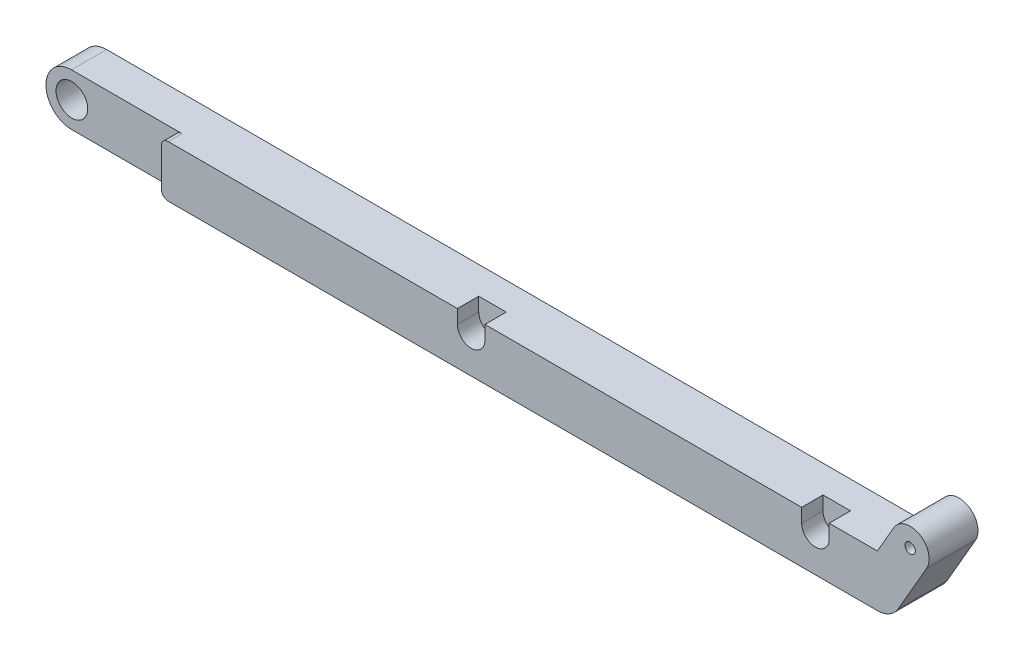
ISO-10303-21;
HEADER;
FILE_DESCRIPTION(('STEP AP214'),'2;1');
FILE_NAME('part.step','',(''),(''),'','','');
FILE_SCHEMA(('AUTOMOTIVE_DESIGN { 1 0 10303 214 1 1 1 1 }'));
ENDSEC;
DATA;
#1=APPLICATION_CONTEXT('core data for automotive mechanical design processes');
#2=APPLICATION_PROTOCOL_DEFINITION('international standard','automotive_design',2000,#1);
#3=PRODUCT_CONTEXT('',#1,'mechanical');
#4=PRODUCT('Part','Part','',(#3));
#5=PRODUCT_RELATED_PRODUCT_CATEGORY('part','',(#4));
#6=PRODUCT_DEFINITION_FORMATION('','',#4);
#7=PRODUCT_DEFINITION_CONTEXT('part definition',#1,'design');
#8=PRODUCT_DEFINITION('design','',#6,#7);
#9=PRODUCT_DEFINITION_SHAPE('','',#8);
#10=(LENGTH_UNIT() NAMED_UNIT(*) SI_UNIT(.MILLI.,.METRE.));
#11=(NAMED_UNIT(*) PLANE_ANGLE_UNIT() SI_UNIT($,.RADIAN.));
#12=(NAMED_UNIT(*) SI_UNIT($,.STERADIAN.) SOLID_ANGLE_UNIT());
#13=UNCERTAINTY_MEASURE_WITH_UNIT(LENGTH_MEASURE(1.E-05),#10,'distance_accuracy_value','');
#14=(GEOMETRIC_REPRESENTATION_CONTEXT(3) GLOBAL_UNCERTAINTY_ASSIGNED_CONTEXT((#13)) GLOBAL_UNIT_ASSIGNED_CONTEXT((#10,
#11,#12)) REPRESENTATION_CONTEXT('',''));
#15=CARTESIAN_POINT('',(0.,0.,0.));
#16=DIRECTION('',(0.,0.,1.));
#17=DIRECTION('',(1.,0.,0.));
#18=AXIS2_PLACEMENT_3D('',#15,#16,#17);
#19=CARTESIAN_POINT('',(101.25,3.50000000000002,10.2));
#20=DIRECTION('',(0.,0.,-1.));
#21=DIRECTION('',(-1.,0.,0.));
#22=AXIS2_PLACEMENT_3D('',#19,#20,#21);
#23=CYLINDRICAL_SURFACE('',#22,4.);
#24=CARTESIAN_POINT('',(101.25,3.50000000000001,8.));
#25=DIRECTION('',(0.,0.,-1.));
#26=DIRECTION('',(-1.,0.,0.));
#27=AXIS2_PLACEMENT_3D('',#24,#25,#26);
#28=CIRCLE('',#27,4.);
#29=CARTESIAN_POINT('',(105.25,3.50000000000002,8.));
#30=VERTEX_POINT('',#29);
#31=CARTESIAN_POINT('',(97.2500000000003,3.50000000000002,8.));
#32=VERTEX_POINT('',#31);
#33=EDGE_CURVE('E251',#30,#32,#28,.T.);
#34=ORIENTED_EDGE('',*,*,#33,.T.);
#35=DIRECTION('',(0.,0.,-1.));
#36=VECTOR('',#35,1.);
#37=CARTESIAN_POINT('',(97.2500000000003,3.50000000000002,10.2));
#38=LINE('',#37,#36);
#39=CARTESIAN_POINT('',(97.2500000000003,3.50000000000002,14.2));
#40=VERTEX_POINT('',#39);
#41=EDGE_CURVE('E345',#40,#32,#38,.T.);
#42=ORIENTED_EDGE('',*,*,#41,.F.);
#43=CARTESIAN_POINT('',(101.25,3.50000000000002,14.2));
#44=DIRECTION('',(0.,0.,-1.));
#45=DIRECTION('',(1.,0.,0.));
#46=AXIS2_PLACEMENT_3D('',#43,#44,#45);
#47=CIRCLE('',#46,4.);
#48=CARTESIAN_POINT('',(105.25,3.50000000000002,14.2));
#49=VERTEX_POINT('',#48);
#50=EDGE_CURVE('E221',#49,#40,#47,.T.);
#51=ORIENTED_EDGE('',*,*,#50,.F.);
#52=DIRECTION('',(0.,0.,-1.));
#53=VECTOR('',#52,1.);
#54=CARTESIAN_POINT('',(105.25,3.50000000000002,10.2));
#55=LINE('',#54,#53);
#56=EDGE_CURVE('E290',#49,#30,#55,.T.);
#57=ORIENTED_EDGE('',*,*,#56,.T.);
#58=EDGE_LOOP('',(#34,#42,#51,#57));
#59=FACE_BOUND('',#58,.T.);
#60=ADVANCED_FACE('F33',(#59),#23,.F.);
#61=CARTESIAN_POINT('',(97.2500000000003,3.50000000000002,10.2));
#62=DIRECTION('',(-1.,0.,0.));
#63=DIRECTION('',(0.,0.,1.));
#64=AXIS2_PLACEMENT_3D('',#61,#62,#63);
#65=PLANE('',#64);
#66=DIRECTION('',(0.,1.,0.));
#67=VECTOR('',#66,1.);
#68=CARTESIAN_POINT('',(97.2500000000003,7.50000000000002,8.));
#69=LINE('',#68,#67);
#70=CARTESIAN_POINT('',(97.2500000000003,7.50000000000002,8.));
#71=VERTEX_POINT('',#70);
#72=EDGE_CURVE('E255',#32,#71,#69,.T.);
#73=ORIENTED_EDGE('',*,*,#72,.T.);
#74=DIRECTION('',(0.,0.,-1.));
#75=VECTOR('',#74,1.);
#76=CARTESIAN_POINT('',(97.2500000000003,7.50000000000002,10.2));
#77=LINE('',#76,#75);
#78=CARTESIAN_POINT('',(97.2500000000003,7.50000000000002,14.2));
#79=VERTEX_POINT('',#78);
#80=EDGE_CURVE('E342',#79,#71,#77,.T.);
#81=ORIENTED_EDGE('',*,*,#80,.F.);
#82=DIRECTION('',(0.,1.,0.));
#83=VECTOR('',#82,1.);
#84=CARTESIAN_POINT('',(97.2500000000003,3.50000000000002,14.2));
#85=LINE('',#84,#83);
#86=EDGE_CURVE('E224',#40,#79,#85,.T.);
#87=ORIENTED_EDGE('',*,*,#86,.F.);
#88=ORIENTED_EDGE('',*,*,#41,.T.);
#89=EDGE_LOOP('',(#73,#81,#87,#88));
#90=FACE_BOUND('',#89,.T.);
#91=ADVANCED_FACE('F421',(#90),#65,.F.);
#92=CARTESIAN_POINT('',(105.25,3.50000000000002,10.2));
#93=DIRECTION('',(1.,0.,0.));
#94=DIRECTION('',(0.,0.,-1.));
#95=AXIS2_PLACEMENT_3D('',#92,#93,#94);
#96=PLANE('',#95);
#97=DIRECTION('',(0.,-1.,0.));
#98=VECTOR('',#97,1.);
#99=CARTESIAN_POINT('',(105.25,3.50000000000002,8.));
#100=LINE('',#99,#98);
#101=CARTESIAN_POINT('',(105.25,7.50000000000002,8.));
#102=VERTEX_POINT('',#101);
#103=EDGE_CURVE('E260',#102,#30,#100,.T.);
#104=ORIENTED_EDGE('',*,*,#103,.T.);
#105=ORIENTED_EDGE('',*,*,#56,.F.);
#106=DIRECTION('',(0.,-1.,0.));
#107=VECTOR('',#106,1.);
#108=CARTESIAN_POINT('',(105.25,7.50000000000002,14.2));
#109=LINE('',#108,#107);
#110=CARTESIAN_POINT('',(105.25,7.50000000000002,14.2));
#111=VERTEX_POINT('',#110);
#112=EDGE_CURVE('E218',#111,#49,#109,.T.);
#113=ORIENTED_EDGE('',*,*,#112,.F.);
#114=DIRECTION('',(0.,0.,-1.));
#115=VECTOR('',#114,1.);
#116=CARTESIAN_POINT('',(105.25,7.50000000000002,10.2));
#117=LINE('',#116,#115);
#118=EDGE_CURVE('E308',#111,#102,#117,.T.);
#119=ORIENTED_EDGE('',*,*,#118,.T.);
#120=EDGE_LOOP('',(#104,#105,#113,#119));
#121=FACE_BOUND('',#120,.T.);
#122=ADVANCED_FACE('F427',(#121),#96,.F.);
#123=CARTESIAN_POINT('',(101.25,3.50000000000002,10.2));
#124=DIRECTION('',(0.,0.,1.));
#125=DIRECTION('',(1.,0.,0.));
#126=AXIS2_PLACEMENT_3D('',#123,#124,#125);
#127=PLANE('',#126);
#128=DIRECTION('',(0.,-1.,0.));
#129=VECTOR('',#128,1.);
#130=CARTESIAN_POINT('',(-88.7499999999997,7.49999999999999,10.2));
#131=LINE('',#130,#129);
#132=CARTESIAN_POINT('',(-88.7499999999997,5.49999999999993,10.2));
#133=VERTEX_POINT('',#132);
#134=CARTESIAN_POINT('',(-88.7499999999997,-5.5,10.2));
#135=VERTEX_POINT('',#134);
#136=EDGE_CURVE('E240',#133,#135,#131,.T.);
#137=ORIENTED_EDGE('',*,*,#136,.F.);
#138=CARTESIAN_POINT('',(-86.7499999999997,5.49999999999993,10.2));
#139=DIRECTION('',(0.,0.,1.));
#140=DIRECTION('',(1.,0.,0.));
#141=AXIS2_PLACEMENT_3D('',#138,#139,#140);
#142=CIRCLE('',#141,2.);
#143=CARTESIAN_POINT('',(-86.7499999999997,7.49999999999993,10.2));
#144=VERTEX_POINT('',#143);
#145=EDGE_CURVE('E11',#133,#144,#142,.F.);
#146=ORIENTED_EDGE('',*,*,#145,.T.);
#147=DIRECTION('',(-1.,0.,0.));
#148=VECTOR('',#147,1.);
#149=CARTESIAN_POINT('',(-118.85,7.5,10.2));
#150=LINE('',#149,#148);
#151=CARTESIAN_POINT('',(-118.85,7.5,10.2));
#152=VERTEX_POINT('',#151);
#153=EDGE_CURVE('E48',#144,#152,#150,.T.);
#154=ORIENTED_EDGE('',*,*,#153,.T.);
#155=CARTESIAN_POINT('',(-118.85,0.0999999999999988,10.2));
#156=DIRECTION('',(0.,0.,1.));
#157=DIRECTION('',(1.,0.,0.));
#158=AXIS2_PLACEMENT_3D('',#155,#156,#157);
#159=CIRCLE('',#158,7.39999999999999);
#160=CARTESIAN_POINT('',(-126.25,0.0999999999999997,10.2));
#161=VERTEX_POINT('',#160);
#162=EDGE_CURVE('E281',#152,#161,#159,.T.);
#163=ORIENTED_EDGE('',*,*,#162,.T.);
#164=DIRECTION('',(0.,-1.,0.));
#165=VECTOR('',#164,1.);
#166=CARTESIAN_POINT('',(-126.25,0.0999999999999988,10.2));
#167=LINE('',#166,#165);
#168=CARTESIAN_POINT('',(-126.25,-0.0999999999999994,10.2));
#169=VERTEX_POINT('',#168);
#170=EDGE_CURVE('E284',#161,#169,#167,.T.);
#171=ORIENTED_EDGE('',*,*,#170,.T.);
#172=CARTESIAN_POINT('',(-118.85,-0.0999999999999985,10.2));
#173=DIRECTION('',(0.,0.,1.));
#174=DIRECTION('',(1.,0.,0.));
#175=AXIS2_PLACEMENT_3D('',#172,#173,#174);
#176=CIRCLE('',#175,7.39999999999999);
#177=CARTESIAN_POINT('',(-118.85,-7.49999999999999,10.2));
#178=VERTEX_POINT('',#177);
#179=EDGE_CURVE('E286',#169,#178,#176,.T.);
#180=ORIENTED_EDGE('',*,*,#179,.T.);
#181=DIRECTION('',(1.,0.,0.));
#182=VECTOR('',#181,1.);
#183=CARTESIAN_POINT('',(-118.85,-7.5,10.2));
#184=LINE('',#183,#182);
#185=CARTESIAN_POINT('',(-86.7499999999997,-7.5,10.2));
#186=VERTEX_POINT('',#185);
#187=EDGE_CURVE('E288',#178,#186,#184,.T.);
#188=ORIENTED_EDGE('',*,*,#187,.T.);
#189=CARTESIAN_POINT('',(-86.7499999999997,-5.5,10.2));
#190=DIRECTION('',(0.,0.,1.));
#191=DIRECTION('',(1.,0.,0.));
#192=AXIS2_PLACEMENT_3D('',#189,#190,#191);
#193=CIRCLE('',#192,2.);
#194=EDGE_CURVE('E41',#186,#135,#193,.F.);
#195=ORIENTED_EDGE('',*,*,#194,.T.);
#196=EDGE_LOOP('',(#137,#146,#154,#163,#171,#180,#188,#195));
#197=FACE_BOUND('',#196,.T.);
#198=CARTESIAN_POINT('',(-118.75,0.,10.2));
#199=DIRECTION('',(0.,0.,1.));
#200=DIRECTION('',(1.,0.,0.));
#201=AXIS2_PLACEMENT_3D('',#198,#199,#200);
#202=CIRCLE('',#201,4.59999999999998);
#203=CARTESIAN_POINT('',(-114.15,0.,10.2));
#204=VERTEX_POINT('',#203);
#205=EDGE_CURVE('E274',#204,#204,#202,.T.);
#206=ORIENTED_EDGE('',*,*,#205,.F.);
#207=EDGE_LOOP('',(#206));
#208=FACE_BOUND('',#207,.T.);
#209=ADVANCED_FACE('F361',(#197,#208),#127,.T.);
#210=CARTESIAN_POINT('',(101.25,3.50000000000002,0.));
#211=DIRECTION('',(0.,0.,1.));
#212=DIRECTION('',(1.,0.,0.));
#213=AXIS2_PLACEMENT_3D('',#210,#211,#212);
#214=PLANE('',#213);
#215=CARTESIAN_POINT('',(128.776279441629,13.,0.));
#216=DIRECTION('',(0.,0.,-1.));
#217=DIRECTION('',(-1.,0.,0.));
#218=AXIS2_PLACEMENT_3D('',#215,#216,#217);
#219=CIRCLE('',#218,3.59999999999999);
#220=CARTESIAN_POINT('',(125.176279441629,13.,0.));
#221=VERTEX_POINT('',#220);
#222=EDGE_CURVE('E247',#221,#221,#219,.T.);
#223=ORIENTED_EDGE('',*,*,#222,.F.);
#224=EDGE_LOOP('',(#223));
#225=FACE_BOUND('',#224,.T.);
#226=CARTESIAN_POINT('',(-118.85,0.0999999999999988,0.));
#227=DIRECTION('',(0.,0.,1.));
#228=DIRECTION('',(1.,0.,0.));
#229=AXIS2_PLACEMENT_3D('',#226,#227,#228);
#230=CIRCLE('',#229,7.39999999999999);
#231=CARTESIAN_POINT('',(-118.85,7.5,0.));
#232=VERTEX_POINT('',#231);
#233=CARTESIAN_POINT('',(-126.25,0.0999999999999997,0.));
#234=VERTEX_POINT('',#233);
#235=EDGE_CURVE('E277',#232,#234,#230,.T.);
#236=ORIENTED_EDGE('',*,*,#235,.F.);
#237=DIRECTION('',(-1.,0.,0.));
#238=VECTOR('',#237,1.);
#239=CARTESIAN_POINT('',(105.25,7.50000000000002,0.));
#240=LINE('',#239,#238);
#241=CARTESIAN_POINT('',(119.25,7.50000000000003,0.));
#242=VERTEX_POINT('',#241);
#243=EDGE_CURVE('E282',#242,#232,#240,.T.);
#244=ORIENTED_EDGE('',*,*,#243,.F.);
#245=DIRECTION('',(-0.499999999999999,-0.866025403784439,0.));
#246=VECTOR('',#245,1.);
#247=CARTESIAN_POINT('',(119.25,7.50000000000003,0.));
#248=LINE('',#247,#246);
#249=CARTESIAN_POINT('',(124.013139720815,15.75,0.));
#250=VERTEX_POINT('',#249);
#251=EDGE_CURVE('E303',#250,#242,#248,.T.);
#252=ORIENTED_EDGE('',*,*,#251,.F.);
#253=CARTESIAN_POINT('',(128.776279441629,13.,0.));
#254=DIRECTION('',(0.,0.,1.));
#255=DIRECTION('',(-1.,0.,0.));
#256=AXIS2_PLACEMENT_3D('',#253,#254,#255);
#257=CIRCLE('',#256,5.49999999999999);
#258=CARTESIAN_POINT('',(133.539419162443,10.2500000000001,0.));
#259=VERTEX_POINT('',#258);
#260=EDGE_CURVE('E301',#259,#250,#257,.T.);
#261=ORIENTED_EDGE('',*,*,#260,.F.);
#262=DIRECTION('',(0.499999999999996,0.866025403784441,0.));
#263=VECTOR('',#262,1.);
#264=CARTESIAN_POINT('',(125.312177826491,-3.99999999999998,0.));
#265=LINE('',#264,#263);
#266=CARTESIAN_POINT('',(125.312177826491,-3.99999999999997,0.));
#267=VERTEX_POINT('',#266);
#268=EDGE_CURVE('E299',#267,#259,#265,.T.);
#269=ORIENTED_EDGE('',*,*,#268,.F.);
#270=CARTESIAN_POINT('',(119.25,-0.499999999999999,0.));
#271=DIRECTION('',(0.,0.,1.));
#272=DIRECTION('',(1.,0.,0.));
#273=AXIS2_PLACEMENT_3D('',#270,#271,#272);
#274=CIRCLE('',#273,7.00000000000001);
#275=CARTESIAN_POINT('',(119.25,-7.5,0.));
#276=VERTEX_POINT('',#275);
#277=EDGE_CURVE('E297',#276,#267,#274,.T.);
#278=ORIENTED_EDGE('',*,*,#277,.F.);
#279=DIRECTION('',(1.,0.,0.));
#280=VECTOR('',#279,1.);
#281=CARTESIAN_POINT('',(-118.85,-7.5,0.));
#282=LINE('',#281,#280);
#283=CARTESIAN_POINT('',(-118.85,-7.49999999999999,0.));
#284=VERTEX_POINT('',#283);
#285=EDGE_CURVE('E196',#284,#276,#282,.T.);
#286=ORIENTED_EDGE('',*,*,#285,.F.);
#287=CARTESIAN_POINT('',(-118.85,-0.0999999999999985,0.));
#288=DIRECTION('',(0.,0.,1.));
#289=DIRECTION('',(1.,0.,0.));
#290=AXIS2_PLACEMENT_3D('',#287,#288,#289);
#291=CIRCLE('',#290,7.39999999999999);
#292=CARTESIAN_POINT('',(-126.25,-0.0999999999999994,0.));
#293=VERTEX_POINT('',#292);
#294=EDGE_CURVE('E294',#293,#284,#291,.T.);
#295=ORIENTED_EDGE('',*,*,#294,.F.);
#296=DIRECTION('',(0.,-1.,0.));
#297=VECTOR('',#296,1.);
#298=CARTESIAN_POINT('',(-126.25,0.0999999999999988,0.));
#299=LINE('',#298,#297);
#300=EDGE_CURVE('E292',#234,#293,#299,.T.);
#301=ORIENTED_EDGE('',*,*,#300,.F.);
#302=EDGE_LOOP('',(#236,#244,#252,#261,#269,#278,#286,#295,#301));
#303=FACE_BOUND('',#302,.T.);
#304=CARTESIAN_POINT('',(-118.75,0.,0.));
#305=DIRECTION('',(0.,0.,1.));
#306=DIRECTION('',(1.,0.,0.));
#307=AXIS2_PLACEMENT_3D('',#304,#305,#306);
#308=CIRCLE('',#307,4.59999999999998);
#309=CARTESIAN_POINT('',(-114.15,0.,0.));
#310=VERTEX_POINT('',#309);
#311=EDGE_CURVE('E273',#310,#310,#308,.T.);
#312=ORIENTED_EDGE('',*,*,#311,.T.);
#313=EDGE_LOOP('',(#312));
#314=FACE_BOUND('',#313,.T.);
#315=ADVANCED_FACE('F377',(#225,#303,#314),#214,.F.);
#316=CARTESIAN_POINT('',(5.25000000000027,3.50000000000002,10.2));
#317=DIRECTION('',(1.,0.,0.));
#318=DIRECTION('',(0.,0.,-1.));
#319=AXIS2_PLACEMENT_3D('',#316,#317,#318);
#320=PLANE('',#319);
#321=DIRECTION('',(0.,0.,-1.));
#322=VECTOR('',#321,1.);
#323=CARTESIAN_POINT('',(5.25000000000027,7.50000000000002,10.2));
#324=LINE('',#323,#322);
#325=CARTESIAN_POINT('',(5.25000000000027,7.50000000000002,14.2));
#326=VERTEX_POINT('',#325);
#327=CARTESIAN_POINT('',(5.25000000000027,7.50000000000002,8.));
#328=VERTEX_POINT('',#327);
#329=EDGE_CURVE('E339',#326,#328,#324,.T.);
#330=ORIENTED_EDGE('',*,*,#329,.T.);
#331=DIRECTION('',(0.,-1.,0.));
#332=VECTOR('',#331,1.);
#333=CARTESIAN_POINT('',(5.25000000000027,3.49999999999999,8.));
#334=LINE('',#333,#332);
#335=CARTESIAN_POINT('',(5.25000000000027,3.49999999999999,8.));
#336=VERTEX_POINT('',#335);
#337=EDGE_CURVE('E270',#328,#336,#334,.T.);
#338=ORIENTED_EDGE('',*,*,#337,.T.);
#339=DIRECTION('',(0.,0.,-1.));
#340=VECTOR('',#339,1.);
#341=CARTESIAN_POINT('',(5.25000000000027,3.50000000000002,10.2));
#342=LINE('',#341,#340);
#343=CARTESIAN_POINT('',(5.25000000000027,3.50000000000002,14.2));
#344=VERTEX_POINT('',#343);
#345=EDGE_CURVE('E336',#344,#336,#342,.T.);
#346=ORIENTED_EDGE('',*,*,#345,.F.);
#347=DIRECTION('',(0.,-1.,0.));
#348=VECTOR('',#347,1.);
#349=CARTESIAN_POINT('',(5.25000000000027,7.50000000000002,14.2));
#350=LINE('',#349,#348);
#351=EDGE_CURVE('E230',#326,#344,#350,.T.);
#352=ORIENTED_EDGE('',*,*,#351,.F.);
#353=EDGE_LOOP('',(#330,#338,#346,#352));
#354=FACE_BOUND('',#353,.T.);
#355=ADVANCED_FACE('F455',(#354),#320,.F.);
#356=CARTESIAN_POINT('',(1.25000000000026,3.50000000000002,10.2));
#357=DIRECTION('',(0.,0.,-1.));
#358=DIRECTION('',(-1.,0.,0.));
#359=AXIS2_PLACEMENT_3D('',#356,#357,#358);
#360=CYLINDRICAL_SURFACE('',#359,4.);
#361=ORIENTED_EDGE('',*,*,#345,.T.);
#362=CARTESIAN_POINT('',(1.25000000000027,3.50000000000002,8.));
#363=DIRECTION('',(0.,0.,-1.));
#364=DIRECTION('',(1.,0.,0.));
#365=AXIS2_PLACEMENT_3D('',#362,#363,#364);
#366=CIRCLE('',#365,4.);
#367=CARTESIAN_POINT('',(-2.74999999999974,3.50000000000002,8.));
#368=VERTEX_POINT('',#367);
#369=EDGE_CURVE('E262',#336,#368,#366,.T.);
#370=ORIENTED_EDGE('',*,*,#369,.T.);
#371=DIRECTION('',(0.,0.,-1.));
#372=VECTOR('',#371,1.);
#373=CARTESIAN_POINT('',(-2.74999999999974,3.50000000000002,10.2));
#374=LINE('',#373,#372);
#375=CARTESIAN_POINT('',(-2.74999999999974,3.50000000000002,14.2));
#376=VERTEX_POINT('',#375);
#377=EDGE_CURVE('E333',#376,#368,#374,.T.);
#378=ORIENTED_EDGE('',*,*,#377,.F.);
#379=CARTESIAN_POINT('',(1.25000000000026,3.50000000000002,14.2));
#380=DIRECTION('',(0.,0.,-1.));
#381=DIRECTION('',(1.,0.,0.));
#382=AXIS2_PLACEMENT_3D('',#379,#380,#381);
#383=CIRCLE('',#382,4.);
#384=EDGE_CURVE('E233',#344,#376,#383,.T.);
#385=ORIENTED_EDGE('',*,*,#384,.F.);
#386=EDGE_LOOP('',(#361,#370,#378,#385));
#387=FACE_BOUND('',#386,.T.);
#388=ADVANCED_FACE('F484',(#387),#360,.F.);
#389=CARTESIAN_POINT('',(-2.74999999999974,3.50000000000002,10.2));
#390=DIRECTION('',(-1.,0.,0.));
#391=DIRECTION('',(0.,-1.,0.));
#392=AXIS2_PLACEMENT_3D('',#389,#390,#391);
#393=PLANE('',#392);
#394=ORIENTED_EDGE('',*,*,#377,.T.);
#395=DIRECTION('',(0.,1.,0.));
#396=VECTOR('',#395,1.);
#397=CARTESIAN_POINT('',(-2.74999999999974,7.50000000000002,8.));
#398=LINE('',#397,#396);
#399=CARTESIAN_POINT('',(-2.74999999999974,7.50000000000002,8.));
#400=VERTEX_POINT('',#399);
#401=EDGE_CURVE('E265',#368,#400,#398,.T.);
#402=ORIENTED_EDGE('',*,*,#401,.T.);
#403=DIRECTION('',(0.,0.,-1.));
#404=VECTOR('',#403,1.);
#405=CARTESIAN_POINT('',(-2.74999999999974,7.50000000000001,10.2));
#406=LINE('',#405,#404);
#407=CARTESIAN_POINT('',(-2.74999999999974,7.50000000000001,14.2));
#408=VERTEX_POINT('',#407);
#409=EDGE_CURVE('E330',#408,#400,#406,.T.);
#410=ORIENTED_EDGE('',*,*,#409,.F.);
#411=DIRECTION('',(0.,1.,0.));
#412=VECTOR('',#411,1.);
#413=CARTESIAN_POINT('',(-2.74999999999974,3.50000000000002,14.2));
#414=LINE('',#413,#412);
#415=EDGE_CURVE('E236',#376,#408,#414,.T.);
#416=ORIENTED_EDGE('',*,*,#415,.F.);
#417=EDGE_LOOP('',(#394,#402,#410,#416));
#418=FACE_BOUND('',#417,.T.);
#419=ADVANCED_FACE('F481',(#418),#393,.F.);
#420=CARTESIAN_POINT('',(-118.85,0.0999999999999988,10.2));
#421=DIRECTION('',(0.,0.,-1.));
#422=DIRECTION('',(-1.,0.,0.));
#423=AXIS2_PLACEMENT_3D('',#420,#421,#422);
#424=CYLINDRICAL_SURFACE('',#423,7.39999999999999);
#425=ORIENTED_EDGE('',*,*,#235,.T.);
#426=DIRECTION('',(0.,0.,-1.));
#427=VECTOR('',#426,1.);
#428=CARTESIAN_POINT('',(-126.25,0.0999999999999997,10.2));
#429=LINE('',#428,#427);
#430=EDGE_CURVE('E324',#161,#234,#429,.T.);
#431=ORIENTED_EDGE('',*,*,#430,.F.);
#432=ORIENTED_EDGE('',*,*,#162,.F.);
#433=DIRECTION('',(0.,0.,-1.));
#434=VECTOR('',#433,1.);
#435=CARTESIAN_POINT('',(-118.85,7.5,10.2));
#436=LINE('',#435,#434);
#437=EDGE_CURVE('E327',#152,#232,#436,.T.);
#438=ORIENTED_EDGE('',*,*,#437,.T.);
#439=EDGE_LOOP('',(#425,#431,#432,#438));
#440=FACE_BOUND('',#439,.T.);
#441=ADVANCED_FACE('F396',(#440),#424,.T.);
#442=CARTESIAN_POINT('',(-126.25,0.0999999999999988,10.2));
#443=DIRECTION('',(1.,0.,0.));
#444=DIRECTION('',(0.,0.,-1.));
#445=AXIS2_PLACEMENT_3D('',#442,#443,#444);
#446=PLANE('',#445);
#447=ORIENTED_EDGE('',*,*,#300,.T.);
#448=DIRECTION('',(0.,0.,-1.));
#449=VECTOR('',#448,1.);
#450=CARTESIAN_POINT('',(-126.25,-0.0999999999999994,10.2));
#451=LINE('',#450,#449);
#452=EDGE_CURVE('E321',#169,#293,#451,.T.);
#453=ORIENTED_EDGE('',*,*,#452,.F.);
#454=ORIENTED_EDGE('',*,*,#170,.F.);
#455=ORIENTED_EDGE('',*,*,#430,.T.);
#456=EDGE_LOOP('',(#447,#453,#454,#455));
#457=FACE_BOUND('',#456,.T.);
#458=ADVANCED_FACE('F475',(#457),#446,.F.);
#459=CARTESIAN_POINT('',(-118.85,-0.0999999999999985,10.2));
#460=DIRECTION('',(0.,0.,-1.));
#461=DIRECTION('',(-1.,0.,0.));
#462=AXIS2_PLACEMENT_3D('',#459,#460,#461);
#463=CYLINDRICAL_SURFACE('',#462,7.39999999999999);
#464=ORIENTED_EDGE('',*,*,#294,.T.);
#465=DIRECTION('',(0.,0.,-1.));
#466=VECTOR('',#465,1.);
#467=CARTESIAN_POINT('',(-118.85,-7.49999999999999,10.2));
#468=LINE('',#467,#466);
#469=EDGE_CURVE('E199',#178,#284,#468,.T.);
#470=ORIENTED_EDGE('',*,*,#469,.F.);
#471=ORIENTED_EDGE('',*,*,#179,.F.);
#472=ORIENTED_EDGE('',*,*,#452,.T.);
#473=EDGE_LOOP('',(#464,#470,#471,#472));
#474=FACE_BOUND('',#473,.T.);
#475=ADVANCED_FACE('F472',(#474),#463,.T.);
#476=CARTESIAN_POINT('',(-118.85,-7.5,10.2));
#477=DIRECTION('',(0.,1.,0.));
#478=DIRECTION('',(-1.,0.,0.));
#479=AXIS2_PLACEMENT_3D('',#476,#477,#478);
#480=PLANE('',#479);
#481=DIRECTION('',(1.,0.,0.));
#482=VECTOR('',#481,1.);
#483=CARTESIAN_POINT('',(-88.7499999999997,-7.49999999999998,14.2));
#484=LINE('',#483,#482);
#485=CARTESIAN_POINT('',(-86.7499999999997,-7.49999999999998,14.2));
#486=VERTEX_POINT('',#485);
#487=CARTESIAN_POINT('',(119.25,-7.50000000000001,14.2));
#488=VERTEX_POINT('',#487);
#489=EDGE_CURVE('E175',#486,#488,#484,.T.);
#490=ORIENTED_EDGE('',*,*,#489,.F.);
#491=DIRECTION('',(0.,0.,-1.));
#492=VECTOR('',#491,1.);
#493=CARTESIAN_POINT('',(-86.7499999999997,-7.5,10.2));
#494=LINE('',#493,#492);
#495=EDGE_CURVE('E348',#486,#186,#494,.T.);
#496=ORIENTED_EDGE('',*,*,#495,.T.);
#497=ORIENTED_EDGE('',*,*,#187,.F.);
#498=ORIENTED_EDGE('',*,*,#469,.T.);
#499=ORIENTED_EDGE('',*,*,#285,.T.);
#500=DIRECTION('',(0.,0.,-1.));
#501=VECTOR('',#500,1.);
#502=CARTESIAN_POINT('',(119.25,-7.5,10.2));
#503=LINE('',#502,#501);
#504=EDGE_CURVE('E192',#488,#276,#503,.T.);
#505=ORIENTED_EDGE('',*,*,#504,.F.);
#506=EDGE_LOOP('',(#490,#496,#497,#498,#499,#505));
#507=FACE_BOUND('',#506,.T.);
#508=ADVANCED_FACE('F193',(#507),#480,.F.);
#509=CARTESIAN_POINT('',(119.25,-0.499999999999999,10.2));
#510=DIRECTION('',(0.,0.,-1.));
#511=DIRECTION('',(-1.,0.,0.));
#512=AXIS2_PLACEMENT_3D('',#509,#510,#511);
#513=CYLINDRICAL_SURFACE('',#512,7.00000000000001);
#514=ORIENTED_EDGE('',*,*,#277,.T.);
#515=DIRECTION('',(0.,0.,-1.));
#516=VECTOR('',#515,1.);
#517=CARTESIAN_POINT('',(125.312177826491,-3.99999999999997,10.2));
#518=LINE('',#517,#516);
#519=CARTESIAN_POINT('',(125.312177826491,-3.99999999999997,14.2));
#520=VERTEX_POINT('',#519);
#521=EDGE_CURVE('E200',#520,#267,#518,.T.);
#522=ORIENTED_EDGE('',*,*,#521,.F.);
#523=CARTESIAN_POINT('',(119.25,-0.499999999999999,14.2));
#524=DIRECTION('',(0.,0.,1.));
#525=DIRECTION('',(1.,0.,0.));
#526=AXIS2_PLACEMENT_3D('',#523,#524,#525);
#527=CIRCLE('',#526,7.00000000000002);
#528=EDGE_CURVE('E182',#488,#520,#527,.T.);
#529=ORIENTED_EDGE('',*,*,#528,.F.);
#530=ORIENTED_EDGE('',*,*,#504,.T.);
#531=EDGE_LOOP('',(#514,#522,#529,#530));
#532=FACE_BOUND('',#531,.T.);
#533=ADVANCED_FACE('F202',(#532),#513,.T.);
#534=CARTESIAN_POINT('',(125.312177826491,-3.99999999999998,10.2));
#535=DIRECTION('',(-0.866025403784441,0.499999999999996,0.));
#536=DIRECTION('',(-0.499999999999996,-0.866025403784441,0.));
#537=AXIS2_PLACEMENT_3D('',#534,#535,#536);
#538=PLANE('',#537);
#539=ORIENTED_EDGE('',*,*,#268,.T.);
#540=DIRECTION('',(0.,0.,-1.));
#541=VECTOR('',#540,1.);
#542=CARTESIAN_POINT('',(133.539419162443,10.2500000000001,10.2));
#543=LINE('',#542,#541);
#544=CARTESIAN_POINT('',(133.539419162443,10.2500000000001,14.2));
#545=VERTEX_POINT('',#544);
#546=EDGE_CURVE('E316',#545,#259,#543,.T.);
#547=ORIENTED_EDGE('',*,*,#546,.F.);
#548=DIRECTION('',(0.499999999999996,0.866025403784441,0.));
#549=VECTOR('',#548,1.);
#550=CARTESIAN_POINT('',(125.312177826491,-3.99999999999997,14.2));
#551=LINE('',#550,#549);
#552=EDGE_CURVE('E204',#520,#545,#551,.T.);
#553=ORIENTED_EDGE('',*,*,#552,.F.);
#554=ORIENTED_EDGE('',*,*,#521,.T.);
#555=EDGE_LOOP('',(#539,#547,#553,#554));
#556=FACE_BOUND('',#555,.T.);
#557=ADVANCED_FACE('F383',(#556),#538,.F.);
#558=CARTESIAN_POINT('',(128.776279441629,13.,10.2));
#559=DIRECTION('',(0.,0.,-1.));
#560=DIRECTION('',(-1.,0.,0.));
#561=AXIS2_PLACEMENT_3D('',#558,#559,#560);
#562=CYLINDRICAL_SURFACE('',#561,5.49999999999999);
#563=ORIENTED_EDGE('',*,*,#260,.T.);
#564=DIRECTION('',(0.,0.,-1.));
#565=VECTOR('',#564,1.);
#566=CARTESIAN_POINT('',(124.013139720815,15.75,10.2));
#567=LINE('',#566,#565);
#568=CARTESIAN_POINT('',(124.013139720815,15.75,14.2));
#569=VERTEX_POINT('',#568);
#570=EDGE_CURVE('E313',#569,#250,#567,.T.);
#571=ORIENTED_EDGE('',*,*,#570,.F.);
#572=CARTESIAN_POINT('',(128.776279441629,13.,14.2));
#573=DIRECTION('',(0.,0.,1.));
#574=DIRECTION('',(1.,0.,0.));
#575=AXIS2_PLACEMENT_3D('',#572,#573,#574);
#576=CIRCLE('',#575,5.49999999999999);
#577=EDGE_CURVE('E206',#545,#569,#576,.T.);
#578=ORIENTED_EDGE('',*,*,#577,.F.);
#579=ORIENTED_EDGE('',*,*,#546,.T.);
#580=EDGE_LOOP('',(#563,#571,#578,#579));
#581=FACE_BOUND('',#580,.T.);
#582=ADVANCED_FACE('F387',(#581),#562,.T.);
#583=CARTESIAN_POINT('',(119.25,7.50000000000003,10.2));
#584=DIRECTION('',(0.866025403784439,-0.499999999999999,0.));
#585=DIRECTION('',(0.499999999999999,0.866025403784439,0.));
#586=AXIS2_PLACEMENT_3D('',#583,#584,#585);
#587=PLANE('',#586);
#588=ORIENTED_EDGE('',*,*,#251,.T.);
#589=DIRECTION('',(0.,0.,-1.));
#590=VECTOR('',#589,1.);
#591=CARTESIAN_POINT('',(119.25,7.50000000000003,10.2));
#592=LINE('',#591,#590);
#593=CARTESIAN_POINT('',(119.25,7.50000000000003,14.2));
#594=VERTEX_POINT('',#593);
#595=EDGE_CURVE('E310',#594,#242,#592,.T.);
#596=ORIENTED_EDGE('',*,*,#595,.F.);
#597=DIRECTION('',(-0.499999999999999,-0.866025403784439,0.));
#598=VECTOR('',#597,1.);
#599=CARTESIAN_POINT('',(124.013139720815,15.75,14.2));
#600=LINE('',#599,#598);
#601=EDGE_CURVE('E212',#569,#594,#600,.T.);
#602=ORIENTED_EDGE('',*,*,#601,.F.);
#603=ORIENTED_EDGE('',*,*,#570,.T.);
#604=EDGE_LOOP('',(#588,#596,#602,#603));
#605=FACE_BOUND('',#604,.T.);
#606=ADVANCED_FACE('F390',(#605),#587,.F.);
#607=CARTESIAN_POINT('',(105.25,7.50000000000002,10.2));
#608=DIRECTION('',(0.,-1.,0.));
#609=DIRECTION('',(1.,0.,0.));
#610=AXIS2_PLACEMENT_3D('',#607,#608,#609);
#611=PLANE('',#610);
#612=ORIENTED_EDGE('',*,*,#153,.F.);
#613=DIRECTION('',(0.,0.,-1.));
#614=VECTOR('',#613,1.);
#615=CARTESIAN_POINT('',(-86.7499999999997,7.49999999999993,10.2));
#616=LINE('',#615,#614);
#617=CARTESIAN_POINT('',(-86.7499999999997,7.49999999999999,14.2));
#618=VERTEX_POINT('',#617);
#619=EDGE_CURVE('E52',#144,#618,#616,.F.);
#620=ORIENTED_EDGE('',*,*,#619,.T.);
#621=DIRECTION('',(-1.,0.,0.));
#622=VECTOR('',#621,1.);
#623=CARTESIAN_POINT('',(-2.74999999999974,7.50000000000001,14.2));
#624=LINE('',#623,#622);
#625=EDGE_CURVE('E243',#408,#618,#624,.T.);
#626=ORIENTED_EDGE('',*,*,#625,.F.);
#627=ORIENTED_EDGE('',*,*,#409,.T.);
#628=DIRECTION('',(1.,0.,0.));
#629=VECTOR('',#628,1.);
#630=CARTESIAN_POINT('',(5.25000000000027,7.50000000000002,8.));
#631=LINE('',#630,#629);
#632=EDGE_CURVE('E268',#400,#328,#631,.T.);
#633=ORIENTED_EDGE('',*,*,#632,.T.);
#634=ORIENTED_EDGE('',*,*,#329,.F.);
#635=DIRECTION('',(-1.,0.,0.));
#636=VECTOR('',#635,1.);
#637=CARTESIAN_POINT('',(97.2500000000003,7.50000000000002,14.2));
#638=LINE('',#637,#636);
#639=EDGE_CURVE('E227',#79,#326,#638,.T.);
#640=ORIENTED_EDGE('',*,*,#639,.F.);
#641=ORIENTED_EDGE('',*,*,#80,.T.);
#642=DIRECTION('',(1.,0.,0.));
#643=VECTOR('',#642,1.);
#644=CARTESIAN_POINT('',(105.25,7.50000000000002,8.));
#645=LINE('',#644,#643);
#646=EDGE_CURVE('E257',#71,#102,#645,.T.);
#647=ORIENTED_EDGE('',*,*,#646,.T.);
#648=ORIENTED_EDGE('',*,*,#118,.F.);
#649=DIRECTION('',(-1.,0.,0.));
#650=VECTOR('',#649,1.);
#651=CARTESIAN_POINT('',(119.25,7.50000000000003,14.2));
#652=LINE('',#651,#650);
#653=EDGE_CURVE('E215',#594,#111,#652,.T.);
#654=ORIENTED_EDGE('',*,*,#653,.F.);
#655=ORIENTED_EDGE('',*,*,#595,.T.);
#656=ORIENTED_EDGE('',*,*,#243,.T.);
#657=ORIENTED_EDGE('',*,*,#437,.F.);
#658=EDGE_LOOP('',(#612,#620,#626,#627,#633,#634,#640,#641,#647,#648,#654,#655,#656,#657));
#659=FACE_BOUND('',#658,.T.);
#660=ADVANCED_FACE('F392',(#659),#611,.F.);
#661=CARTESIAN_POINT('',(-118.75,0.,10.2));
#662=DIRECTION('',(0.,0.,-1.));
#663=DIRECTION('',(-1.,0.,0.));
#664=AXIS2_PLACEMENT_3D('',#661,#662,#663);
#665=CYLINDRICAL_SURFACE('',#664,4.59999999999998);
#666=ORIENTED_EDGE('',*,*,#205,.T.);
#667=EDGE_LOOP('',(#666));
#668=FACE_BOUND('',#667,.T.);
#669=ORIENTED_EDGE('',*,*,#311,.F.);
#670=EDGE_LOOP('',(#669));
#671=FACE_BOUND('',#670,.T.);
#672=ADVANCED_FACE('F447',(#668,#671),#665,.F.);
#673=CARTESIAN_POINT('',(1.25000000000027,3.50000000000002,8.));
#674=DIRECTION('',(0.,0.,1.));
#675=DIRECTION('',(1.,0.,0.));
#676=AXIS2_PLACEMENT_3D('',#673,#674,#675);
#677=PLANE('',#676);
#678=ORIENTED_EDGE('',*,*,#369,.F.);
#679=ORIENTED_EDGE('',*,*,#337,.F.);
#680=ORIENTED_EDGE('',*,*,#632,.F.);
#681=ORIENTED_EDGE('',*,*,#401,.F.);
#682=EDGE_LOOP('',(#678,#679,#680,#681));
#683=FACE_BOUND('',#682,.T.);
#684=ADVANCED_FACE('F445',(#683),#677,.T.);
#685=CARTESIAN_POINT('',(101.25,3.50000000000001,8.));
#686=DIRECTION('',(0.,0.,-1.));
#687=DIRECTION('',(-1.,0.,0.));
#688=AXIS2_PLACEMENT_3D('',#685,#686,#687);
#689=PLANE('',#688);
#690=ORIENTED_EDGE('',*,*,#33,.F.);
#691=ORIENTED_EDGE('',*,*,#103,.F.);
#692=ORIENTED_EDGE('',*,*,#646,.F.);
#693=ORIENTED_EDGE('',*,*,#72,.F.);
#694=EDGE_LOOP('',(#690,#691,#692,#693));
#695=FACE_BOUND('',#694,.T.);
#696=ADVANCED_FACE('F503',(#695),#689,.F.);
#697=CARTESIAN_POINT('',(128.776279441629,13.,5.));
#698=DIRECTION('',(0.,0.,-1.));
#699=DIRECTION('',(-1.,0.,0.));
#700=AXIS2_PLACEMENT_3D('',#697,#698,#699);
#701=CYLINDRICAL_SURFACE('',#700,3.59999999999999);
#702=CARTESIAN_POINT('',(128.776279441629,13.,5.));
#703=DIRECTION('',(0.,0.,-1.));
#704=DIRECTION('',(-1.,0.,0.));
#705=AXIS2_PLACEMENT_3D('',#702,#703,#704);
#706=CIRCLE('',#705,3.59999999999999);
#707=CARTESIAN_POINT('',(125.176279441629,13.,5.));
#708=VERTEX_POINT('',#707);
#709=EDGE_CURVE('E248',#708,#708,#706,.T.);
#710=ORIENTED_EDGE('',*,*,#709,.F.);
#711=EDGE_LOOP('',(#710));
#712=FACE_BOUND('',#711,.T.);
#713=ORIENTED_EDGE('',*,*,#222,.T.);
#714=EDGE_LOOP('',(#713));
#715=FACE_BOUND('',#714,.T.);
#716=ADVANCED_FACE('F417',(#712,#715),#701,.F.);
#717=CARTESIAN_POINT('',(128.776279441629,13.,5.));
#718=DIRECTION('',(0.,0.,-1.));
#719=DIRECTION('',(-1.,0.,0.));
#720=AXIS2_PLACEMENT_3D('',#717,#718,#719);
#721=PLANE('',#720);
#722=ORIENTED_EDGE('',*,*,#709,.T.);
#723=EDGE_LOOP('',(#722));
#724=FACE_BOUND('',#723,.T.);
#725=ADVANCED_FACE('F409',(#724),#721,.T.);
#726=CARTESIAN_POINT('',(119.25,-0.499999999999999,14.2));
#727=DIRECTION('',(0.,0.,1.));
#728=DIRECTION('',(1.,0.,0.));
#729=AXIS2_PLACEMENT_3D('',#726,#727,#728);
#730=PLANE('',#729);
#731=DIRECTION('',(0.,-1.,0.));
#732=VECTOR('',#731,1.);
#733=CARTESIAN_POINT('',(-88.7499999999997,7.49999999999999,14.2));
#734=LINE('',#733,#732);
#735=CARTESIAN_POINT('',(-88.7499999999997,5.49999999999993,14.2));
#736=VERTEX_POINT('',#735);
#737=CARTESIAN_POINT('',(-88.7499999999997,-5.5,14.2));
#738=VERTEX_POINT('',#737);
#739=EDGE_CURVE('E189',#736,#738,#734,.T.);
#740=ORIENTED_EDGE('',*,*,#739,.T.);
#741=CARTESIAN_POINT('',(-86.7499999999997,-5.5,14.2));
#742=DIRECTION('',(0.,0.,1.));
#743=DIRECTION('',(1.,0.,0.));
#744=AXIS2_PLACEMENT_3D('',#741,#742,#743);
#745=CIRCLE('',#744,2.);
#746=EDGE_CURVE('E185',#738,#486,#745,.T.);
#747=ORIENTED_EDGE('',*,*,#746,.T.);
#748=ORIENTED_EDGE('',*,*,#489,.T.);
#749=ORIENTED_EDGE('',*,*,#528,.T.);
#750=ORIENTED_EDGE('',*,*,#552,.T.);
#751=ORIENTED_EDGE('',*,*,#577,.T.);
#752=ORIENTED_EDGE('',*,*,#601,.T.);
#753=ORIENTED_EDGE('',*,*,#653,.T.);
#754=ORIENTED_EDGE('',*,*,#112,.T.);
#755=ORIENTED_EDGE('',*,*,#50,.T.);
#756=ORIENTED_EDGE('',*,*,#86,.T.);
#757=ORIENTED_EDGE('',*,*,#639,.T.);
#758=ORIENTED_EDGE('',*,*,#351,.T.);
#759=ORIENTED_EDGE('',*,*,#384,.T.);
#760=ORIENTED_EDGE('',*,*,#415,.T.);
#761=ORIENTED_EDGE('',*,*,#625,.T.);
#762=CARTESIAN_POINT('',(-86.7499999999997,5.49999999999993,14.2));
#763=DIRECTION('',(0.,0.,1.));
#764=DIRECTION('',(1.,0.,0.));
#765=AXIS2_PLACEMENT_3D('',#762,#763,#764);
#766=CIRCLE('',#765,2.);
#767=EDGE_CURVE('E355',#618,#736,#766,.T.);
#768=ORIENTED_EDGE('',*,*,#767,.T.);
#769=EDGE_LOOP('',(#740,#747,#748,#749,#750,#751,#752,#753,#754,#755,#756,#757,#758,#759,#760,
#761,#768));
#770=FACE_BOUND('',#769,.T.);
#771=CARTESIAN_POINT('',(128.776279441629,13.,14.2));
#772=DIRECTION('',(0.,0.,1.));
#773=DIRECTION('',(1.,0.,0.));
#774=AXIS2_PLACEMENT_3D('',#771,#772,#773);
#775=CIRCLE('',#774,1.5);
#776=CARTESIAN_POINT('',(130.276279441629,13.,14.2));
#777=VERTEX_POINT('',#776);
#778=EDGE_CURVE('E244',#777,#777,#775,.T.);
#779=ORIENTED_EDGE('',*,*,#778,.F.);
#780=EDGE_LOOP('',(#779));
#781=FACE_BOUND('',#780,.T.);
#782=ADVANCED_FACE('F178',(#770,#781),#730,.T.);
#783=CARTESIAN_POINT('',(-88.7499999999997,7.49999999999999,14.2));
#784=DIRECTION('',(1.,0.,0.));
#785=DIRECTION('',(0.,0.,-1.));
#786=AXIS2_PLACEMENT_3D('',#783,#784,#785);
#787=PLANE('',#786);
#788=ORIENTED_EDGE('',*,*,#136,.T.);
#789=DIRECTION('',(0.,0.,-1.));
#790=VECTOR('',#789,1.);
#791=CARTESIAN_POINT('',(-88.7499999999997,-5.5,14.2));
#792=LINE('',#791,#790);
#793=EDGE_CURVE('E353',#135,#738,#792,.F.);
#794=ORIENTED_EDGE('',*,*,#793,.T.);
#795=ORIENTED_EDGE('',*,*,#739,.F.);
#796=DIRECTION('',(0.,0.,-1.));
#797=VECTOR('',#796,1.);
#798=CARTESIAN_POINT('',(-88.7499999999997,5.49999999999993,14.2));
#799=LINE('',#798,#797);
#800=EDGE_CURVE('E350',#736,#133,#799,.T.);
#801=ORIENTED_EDGE('',*,*,#800,.T.);
#802=EDGE_LOOP('',(#788,#794,#795,#801));
#803=FACE_BOUND('',#802,.T.);
#804=ADVANCED_FACE('F367',(#803),#787,.F.);
#805=CARTESIAN_POINT('',(128.776279441629,13.,5.6));
#806=DIRECTION('',(0.,0.,-1.));
#807=DIRECTION('',(-1.,0.,0.));
#808=AXIS2_PLACEMENT_3D('',#805,#806,#807);
#809=PLANE('',#808);
#810=CARTESIAN_POINT('',(128.776279441629,13.,5.6));
#811=DIRECTION('',(0.,0.,-1.));
#812=DIRECTION('',(-1.,0.,0.));
#813=AXIS2_PLACEMENT_3D('',#810,#811,#812);
#814=CIRCLE('',#813,1.5);
#815=CARTESIAN_POINT('',(127.276279441629,13.,5.6));
#816=VERTEX_POINT('',#815);
#817=EDGE_CURVE('E239',#816,#816,#814,.T.);
#818=ORIENTED_EDGE('',*,*,#817,.F.);
#819=EDGE_LOOP('',(#818));
#820=FACE_BOUND('',#819,.T.);
#821=ADVANCED_FACE('F415',(#820),#809,.F.);
#822=CARTESIAN_POINT('',(128.776279441629,13.,10.2));
#823=DIRECTION('',(0.,0.,-1.));
#824=DIRECTION('',(-1.,0.,0.));
#825=AXIS2_PLACEMENT_3D('',#822,#823,#824);
#826=CYLINDRICAL_SURFACE('',#825,1.5);
#827=ORIENTED_EDGE('',*,*,#817,.T.);
#828=EDGE_LOOP('',(#827));
#829=FACE_BOUND('',#828,.T.);
#830=ORIENTED_EDGE('',*,*,#778,.T.);
#831=EDGE_LOOP('',(#830));
#832=FACE_BOUND('',#831,.T.);
#833=ADVANCED_FACE('F407',(#829,#832),#826,.F.);
#834=CARTESIAN_POINT('',(-86.7499999999997,-5.5,10.2));
#835=DIRECTION('',(0.,0.,-1.));
#836=DIRECTION('',(-1.,0.,0.));
#837=AXIS2_PLACEMENT_3D('',#834,#835,#836);
#838=CYLINDRICAL_SURFACE('',#837,2.);
#839=ORIENTED_EDGE('',*,*,#746,.F.);
#840=ORIENTED_EDGE('',*,*,#793,.F.);
#841=ORIENTED_EDGE('',*,*,#194,.F.);
#842=ORIENTED_EDGE('',*,*,#495,.F.);
#843=EDGE_LOOP('',(#839,#840,#841,#842));
#844=FACE_BOUND('',#843,.T.);
#845=ADVANCED_FACE('F370',(#844),#838,.T.);
#846=CARTESIAN_POINT('',(-86.7499999999997,5.49999999999993,14.2));
#847=DIRECTION('',(0.,0.,-1.));
#848=DIRECTION('',(-1.,0.,0.));
#849=AXIS2_PLACEMENT_3D('',#846,#847,#848);
#850=CYLINDRICAL_SURFACE('',#849,2.);
#851=ORIENTED_EDGE('',*,*,#767,.F.);
#852=ORIENTED_EDGE('',*,*,#619,.F.);
#853=ORIENTED_EDGE('',*,*,#145,.F.);
#854=ORIENTED_EDGE('',*,*,#800,.F.);
#855=EDGE_LOOP('',(#851,#852,#853,#854));
#856=FACE_BOUND('',#855,.T.);
#857=ADVANCED_FACE('F35',(#856),#850,.T.);
#858=CLOSED_SHELL('',(#60,#91,#122,#209,#315,#355,#388,#419,#441,#458,#475,#508,#533,#557,#582,
#606,#660,#672,#684,#696,#716,#725,#782,#804,#821,#833,#845,#857));
#859=MANIFOLD_SOLID_BREP('B2',#858);
#860=ADVANCED_BREP_SHAPE_REPRESENTATION('',(#18,#859),#14);
#861=SHAPE_DEFINITION_REPRESENTATION(#9,#860);
ENDSEC;
END-ISO-10303-21;
